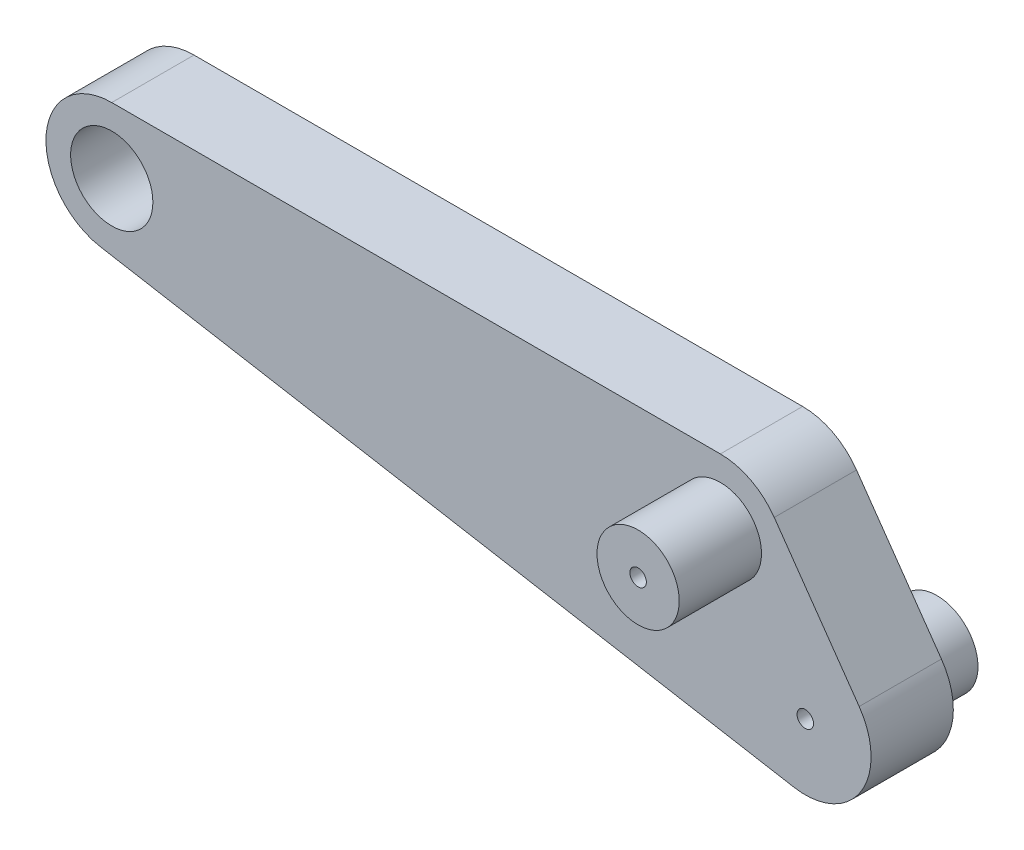
ISO-10303-21;
HEADER;
FILE_DESCRIPTION(('STEP AP214'),'2;1');
FILE_NAME('part.step','',(''),(''),'','','');
FILE_SCHEMA(('AUTOMOTIVE_DESIGN { 1 0 10303 214 1 1 1 1 }'));
ENDSEC;
DATA;
#1=APPLICATION_CONTEXT('core data for automotive mechanical design processes');
#2=APPLICATION_PROTOCOL_DEFINITION('international standard','automotive_design',2000,#1);
#3=PRODUCT_CONTEXT('',#1,'mechanical');
#4=PRODUCT('Part','Part','',(#3));
#5=PRODUCT_RELATED_PRODUCT_CATEGORY('part','',(#4));
#6=PRODUCT_DEFINITION_FORMATION('','',#4);
#7=PRODUCT_DEFINITION_CONTEXT('part definition',#1,'design');
#8=PRODUCT_DEFINITION('design','',#6,#7);
#9=PRODUCT_DEFINITION_SHAPE('','',#8);
#10=(LENGTH_UNIT() NAMED_UNIT(*) SI_UNIT(.MILLI.,.METRE.));
#11=(NAMED_UNIT(*) PLANE_ANGLE_UNIT() SI_UNIT($,.RADIAN.));
#12=(NAMED_UNIT(*) SI_UNIT($,.STERADIAN.) SOLID_ANGLE_UNIT());
#13=UNCERTAINTY_MEASURE_WITH_UNIT(LENGTH_MEASURE(1.E-05),#10,'distance_accuracy_value','');
#14=(GEOMETRIC_REPRESENTATION_CONTEXT(3) GLOBAL_UNCERTAINTY_ASSIGNED_CONTEXT((#13)) GLOBAL_UNIT_ASSIGNED_CONTEXT((#10,
#11,#12)) REPRESENTATION_CONTEXT('',''));
#15=CARTESIAN_POINT('',(0.,0.,0.));
#16=DIRECTION('',(0.,0.,1.));
#17=DIRECTION('',(1.,0.,0.));
#18=AXIS2_PLACEMENT_3D('',#15,#16,#17);
#19=CARTESIAN_POINT('',(0.,0.,5.));
#20=DIRECTION('',(0.,0.,1.));
#21=DIRECTION('',(1.,0.,0.));
#22=AXIS2_PLACEMENT_3D('',#19,#20,#21);
#23=PLANE('',#22);
#24=CARTESIAN_POINT('',(0.,0.,5.));
#25=DIRECTION('',(0.,0.,1.));
#26=DIRECTION('',(1.,0.,0.));
#27=AXIS2_PLACEMENT_3D('',#24,#25,#26);
#28=CIRCLE('',#27,2.5);
#29=CARTESIAN_POINT('',(2.5,0.,5.));
#30=VERTEX_POINT('',#29);
#31=EDGE_CURVE('E215',#30,#30,#28,.T.);
#32=ORIENTED_EDGE('',*,*,#31,.F.);
#33=EDGE_LOOP('',(#32));
#34=FACE_BOUND('',#33,.T.);
#35=CARTESIAN_POINT('',(0.,0.,5.));
#36=DIRECTION('',(0.,0.,1.));
#37=DIRECTION('',(1.,0.,0.));
#38=AXIS2_PLACEMENT_3D('',#35,#36,#37);
#39=CIRCLE('',#38,4.);
#40=CARTESIAN_POINT('',(3.27660817715596,2.2943057454042,5.));
#41=VERTEX_POINT('',#40);
#42=CARTESIAN_POINT('',(0.,4.,5.));
#43=VERTEX_POINT('',#42);
#44=EDGE_CURVE('E130',#41,#43,#39,.T.);
#45=ORIENTED_EDGE('',*,*,#44,.T.);
#46=DIRECTION('',(-1.,0.,0.));
#47=VECTOR('',#46,1.);
#48=CARTESIAN_POINT('',(-37.,3.99999999999999,5.));
#49=LINE('',#48,#47);
#50=CARTESIAN_POINT('',(-37.,3.99999999999999,5.));
#51=VERTEX_POINT('',#50);
#52=EDGE_CURVE('E88',#43,#51,#49,.T.);
#53=ORIENTED_EDGE('',*,*,#52,.T.);
#54=CARTESIAN_POINT('',(-37.,0.,5.));
#55=DIRECTION('',(0.,0.,1.));
#56=DIRECTION('',(1.,0.,0.));
#57=AXIS2_PLACEMENT_3D('',#54,#55,#56);
#58=CIRCLE('',#57,4.);
#59=CARTESIAN_POINT('',(-37.6889759456028,-3.94021727146876,5.));
#60=VERTEX_POINT('',#59);
#61=EDGE_CURVE('E101',#51,#60,#58,.T.);
#62=ORIENTED_EDGE('',*,*,#61,.T.);
#63=DIRECTION('',(0.98505431786719,-0.172243986400701,0.));
#64=VECTOR('',#63,1.);
#65=CARTESIAN_POINT('',(4.47321198155665,-11.3125856700697,5.));
#66=LINE('',#65,#64);
#67=CARTESIAN_POINT('',(4.47321198155665,-11.3125856700697,5.));
#68=VERTEX_POINT('',#67);
#69=EDGE_CURVE('E95',#60,#68,#66,.T.);
#70=ORIENTED_EDGE('',*,*,#69,.T.);
#71=CARTESIAN_POINT('',(5.16218792715945,-7.3723683986009,5.));
#72=DIRECTION('',(0.,0.,1.));
#73=DIRECTION('',(1.,0.,0.));
#74=AXIS2_PLACEMENT_3D('',#71,#72,#73);
#75=CIRCLE('',#74,4.);
#76=CARTESIAN_POINT('',(8.43879610431541,-5.0780626531967,5.));
#77=VERTEX_POINT('',#76);
#78=EDGE_CURVE('E99',#68,#77,#75,.T.);
#79=ORIENTED_EDGE('',*,*,#78,.T.);
#80=DIRECTION('',(-0.57357643635105,0.819152044288989,0.));
#81=VECTOR('',#80,1.);
#82=CARTESIAN_POINT('',(3.27660817715596,2.2943057454042,5.));
#83=LINE('',#82,#81);
#84=EDGE_CURVE('E51',#77,#41,#83,.T.);
#85=ORIENTED_EDGE('',*,*,#84,.T.);
#86=EDGE_LOOP('',(#45,#53,#62,#70,#79,#85));
#87=FACE_BOUND('',#86,.T.);
#88=CARTESIAN_POINT('',(-37.,0.,5.));
#89=DIRECTION('',(0.,0.,1.));
#90=DIRECTION('',(1.,0.,0.));
#91=AXIS2_PLACEMENT_3D('',#88,#89,#90);
#92=CIRCLE('',#91,2.5);
#93=CARTESIAN_POINT('',(-34.5,0.,5.));
#94=VERTEX_POINT('',#93);
#95=EDGE_CURVE('E123',#94,#94,#92,.T.);
#96=ORIENTED_EDGE('',*,*,#95,.F.);
#97=EDGE_LOOP('',(#96));
#98=FACE_BOUND('',#97,.T.);
#99=CARTESIAN_POINT('',(5.16218792715945,-7.3723683986009,5.));
#100=DIRECTION('',(0.,0.,1.));
#101=DIRECTION('',(1.,0.,0.));
#102=AXIS2_PLACEMENT_3D('',#99,#100,#101);
#103=CIRCLE('',#102,0.5);
#104=CARTESIAN_POINT('',(5.66218792715945,-7.3723683986009,5.));
#105=VERTEX_POINT('',#104);
#106=EDGE_CURVE('E203',#105,#105,#103,.T.);
#107=ORIENTED_EDGE('',*,*,#106,.F.);
#108=EDGE_LOOP('',(#107));
#109=FACE_BOUND('',#108,.T.);
#110=ADVANCED_FACE('F34',(#34,#87,#98,#109),#23,.T.);
#111=CARTESIAN_POINT('',(0.,0.,0.));
#112=DIRECTION('',(0.,0.,1.));
#113=DIRECTION('',(1.,0.,0.));
#114=AXIS2_PLACEMENT_3D('',#111,#112,#113);
#115=PLANE('',#114);
#116=CARTESIAN_POINT('',(0.,0.,0.));
#117=DIRECTION('',(0.,0.,1.));
#118=DIRECTION('',(1.,0.,0.));
#119=AXIS2_PLACEMENT_3D('',#116,#117,#118);
#120=CIRCLE('',#119,4.);
#121=CARTESIAN_POINT('',(3.27660817715596,2.2943057454042,0.));
#122=VERTEX_POINT('',#121);
#123=CARTESIAN_POINT('',(0.,4.,0.));
#124=VERTEX_POINT('',#123);
#125=EDGE_CURVE('E119',#122,#124,#120,.T.);
#126=ORIENTED_EDGE('',*,*,#125,.F.);
#127=DIRECTION('',(-0.57357643635105,0.819152044288989,0.));
#128=VECTOR('',#127,1.);
#129=CARTESIAN_POINT('',(3.27660817715596,2.2943057454042,0.));
#130=LINE('',#129,#128);
#131=CARTESIAN_POINT('',(8.43879610431541,-5.0780626531967,0.));
#132=VERTEX_POINT('',#131);
#133=EDGE_CURVE('E80',#132,#122,#130,.T.);
#134=ORIENTED_EDGE('',*,*,#133,.F.);
#135=CARTESIAN_POINT('',(5.16218792715945,-7.3723683986009,0.));
#136=DIRECTION('',(0.,0.,1.));
#137=DIRECTION('',(1.,0.,0.));
#138=AXIS2_PLACEMENT_3D('',#135,#136,#137);
#139=CIRCLE('',#138,4.);
#140=CARTESIAN_POINT('',(4.47321198155665,-11.3125856700697,0.));
#141=VERTEX_POINT('',#140);
#142=EDGE_CURVE('E74',#141,#132,#139,.T.);
#143=ORIENTED_EDGE('',*,*,#142,.F.);
#144=DIRECTION('',(0.98505431786719,-0.172243986400701,0.));
#145=VECTOR('',#144,1.);
#146=CARTESIAN_POINT('',(4.47321198155665,-11.3125856700697,0.));
#147=LINE('',#146,#145);
#148=CARTESIAN_POINT('',(-37.6889759456028,-3.94021727146876,0.));
#149=VERTEX_POINT('',#148);
#150=EDGE_CURVE('E109',#149,#141,#147,.T.);
#151=ORIENTED_EDGE('',*,*,#150,.F.);
#152=CARTESIAN_POINT('',(-37.,0.,0.));
#153=DIRECTION('',(0.,0.,1.));
#154=DIRECTION('',(1.,0.,0.));
#155=AXIS2_PLACEMENT_3D('',#152,#153,#154);
#156=CIRCLE('',#155,4.);
#157=CARTESIAN_POINT('',(-37.,3.99999999999999,0.));
#158=VERTEX_POINT('',#157);
#159=EDGE_CURVE('E125',#158,#149,#156,.T.);
#160=ORIENTED_EDGE('',*,*,#159,.F.);
#161=DIRECTION('',(-1.,0.,0.));
#162=VECTOR('',#161,1.);
#163=CARTESIAN_POINT('',(-37.,3.99999999999999,0.));
#164=LINE('',#163,#162);
#165=EDGE_CURVE('E122',#124,#158,#164,.T.);
#166=ORIENTED_EDGE('',*,*,#165,.F.);
#167=EDGE_LOOP('',(#126,#134,#143,#151,#160,#166));
#168=FACE_BOUND('',#167,.T.);
#169=CARTESIAN_POINT('',(-37.,0.,0.));
#170=DIRECTION('',(0.,0.,1.));
#171=DIRECTION('',(1.,0.,0.));
#172=AXIS2_PLACEMENT_3D('',#169,#170,#171);
#173=CIRCLE('',#172,2.5);
#174=CARTESIAN_POINT('',(-34.5,0.,0.));
#175=VERTEX_POINT('',#174);
#176=EDGE_CURVE('E218',#175,#175,#173,.T.);
#177=ORIENTED_EDGE('',*,*,#176,.T.);
#178=EDGE_LOOP('',(#177));
#179=FACE_BOUND('',#178,.T.);
#180=CARTESIAN_POINT('',(5.16218792715945,-7.3723683986009,0.));
#181=DIRECTION('',(0.,0.,1.));
#182=DIRECTION('',(1.,0.,0.));
#183=AXIS2_PLACEMENT_3D('',#180,#181,#182);
#184=CIRCLE('',#183,2.5);
#185=CARTESIAN_POINT('',(7.66218792715945,-7.3723683986009,0.));
#186=VERTEX_POINT('',#185);
#187=EDGE_CURVE('E212',#186,#186,#184,.T.);
#188=ORIENTED_EDGE('',*,*,#187,.T.);
#189=EDGE_LOOP('',(#188));
#190=FACE_BOUND('',#189,.T.);
#191=CARTESIAN_POINT('',(0.,0.,0.));
#192=DIRECTION('',(0.,0.,-1.));
#193=DIRECTION('',(-1.,0.,0.));
#194=AXIS2_PLACEMENT_3D('',#191,#192,#193);
#195=CIRCLE('',#194,0.5);
#196=CARTESIAN_POINT('',(-0.5,0.,0.));
#197=VERTEX_POINT('',#196);
#198=EDGE_CURVE('E195',#197,#197,#195,.T.);
#199=ORIENTED_EDGE('',*,*,#198,.F.);
#200=EDGE_LOOP('',(#199));
#201=FACE_BOUND('',#200,.T.);
#202=ADVANCED_FACE('F139',(#168,#179,#190,#201),#115,.F.);
#203=CARTESIAN_POINT('',(0.,0.,5.));
#204=DIRECTION('',(0.,0.,-1.));
#205=DIRECTION('',(-1.,0.,0.));
#206=AXIS2_PLACEMENT_3D('',#203,#204,#205);
#207=CYLINDRICAL_SURFACE('',#206,4.);
#208=ORIENTED_EDGE('',*,*,#125,.T.);
#209=DIRECTION('',(0.,0.,-1.));
#210=VECTOR('',#209,1.);
#211=CARTESIAN_POINT('',(0.,4.,5.));
#212=LINE('',#211,#210);
#213=EDGE_CURVE('E11',#43,#124,#212,.T.);
#214=ORIENTED_EDGE('',*,*,#213,.F.);
#215=ORIENTED_EDGE('',*,*,#44,.F.);
#216=DIRECTION('',(0.,0.,-1.));
#217=VECTOR('',#216,1.);
#218=CARTESIAN_POINT('',(3.27660817715596,2.2943057454042,5.));
#219=LINE('',#218,#217);
#220=EDGE_CURVE('E115',#41,#122,#219,.T.);
#221=ORIENTED_EDGE('',*,*,#220,.T.);
#222=EDGE_LOOP('',(#208,#214,#215,#221));
#223=FACE_BOUND('',#222,.T.);
#224=ADVANCED_FACE('F36',(#223),#207,.T.);
#225=CARTESIAN_POINT('',(-37.,3.99999999999999,5.));
#226=DIRECTION('',(0.,-1.,0.));
#227=DIRECTION('',(1.,0.,0.));
#228=AXIS2_PLACEMENT_3D('',#225,#226,#227);
#229=PLANE('',#228);
#230=ORIENTED_EDGE('',*,*,#165,.T.);
#231=DIRECTION('',(0.,0.,-1.));
#232=VECTOR('',#231,1.);
#233=CARTESIAN_POINT('',(-37.,3.99999999999999,5.));
#234=LINE('',#233,#232);
#235=EDGE_CURVE('E43',#51,#158,#234,.T.);
#236=ORIENTED_EDGE('',*,*,#235,.F.);
#237=ORIENTED_EDGE('',*,*,#52,.F.);
#238=ORIENTED_EDGE('',*,*,#213,.T.);
#239=EDGE_LOOP('',(#230,#236,#237,#238));
#240=FACE_BOUND('',#239,.T.);
#241=ADVANCED_FACE('F303',(#240),#229,.F.);
#242=CARTESIAN_POINT('',(-37.,0.,5.));
#243=DIRECTION('',(0.,0.,-1.));
#244=DIRECTION('',(-1.,0.,0.));
#245=AXIS2_PLACEMENT_3D('',#242,#243,#244);
#246=CYLINDRICAL_SURFACE('',#245,4.);
#247=ORIENTED_EDGE('',*,*,#159,.T.);
#248=DIRECTION('',(0.,0.,-1.));
#249=VECTOR('',#248,1.);
#250=CARTESIAN_POINT('',(-37.6889759456028,-3.94021727146876,5.));
#251=LINE('',#250,#249);
#252=EDGE_CURVE('E110',#60,#149,#251,.T.);
#253=ORIENTED_EDGE('',*,*,#252,.F.);
#254=ORIENTED_EDGE('',*,*,#61,.F.);
#255=ORIENTED_EDGE('',*,*,#235,.T.);
#256=EDGE_LOOP('',(#247,#253,#254,#255));
#257=FACE_BOUND('',#256,.T.);
#258=ADVANCED_FACE('F136',(#257),#246,.T.);
#259=CARTESIAN_POINT('',(4.47321198155665,-11.3125856700697,5.));
#260=DIRECTION('',(0.172243986400701,0.98505431786719,0.));
#261=DIRECTION('',(-0.98505431786719,0.172243986400701,0.));
#262=AXIS2_PLACEMENT_3D('',#259,#260,#261);
#263=PLANE('',#262);
#264=ORIENTED_EDGE('',*,*,#150,.T.);
#265=DIRECTION('',(0.,0.,-1.));
#266=VECTOR('',#265,1.);
#267=CARTESIAN_POINT('',(4.47321198155665,-11.3125856700697,5.));
#268=LINE('',#267,#266);
#269=EDGE_CURVE('E106',#68,#141,#268,.T.);
#270=ORIENTED_EDGE('',*,*,#269,.F.);
#271=ORIENTED_EDGE('',*,*,#69,.F.);
#272=ORIENTED_EDGE('',*,*,#252,.T.);
#273=EDGE_LOOP('',(#264,#270,#271,#272));
#274=FACE_BOUND('',#273,.T.);
#275=ADVANCED_FACE('F107',(#274),#263,.F.);
#276=CARTESIAN_POINT('',(5.16218792715945,-7.3723683986009,5.));
#277=DIRECTION('',(0.,0.,-1.));
#278=DIRECTION('',(-1.,0.,0.));
#279=AXIS2_PLACEMENT_3D('',#276,#277,#278);
#280=CYLINDRICAL_SURFACE('',#279,4.);
#281=ORIENTED_EDGE('',*,*,#142,.T.);
#282=DIRECTION('',(0.,0.,-1.));
#283=VECTOR('',#282,1.);
#284=CARTESIAN_POINT('',(8.43879610431541,-5.0780626531967,5.));
#285=LINE('',#284,#283);
#286=EDGE_CURVE('E111',#77,#132,#285,.T.);
#287=ORIENTED_EDGE('',*,*,#286,.F.);
#288=ORIENTED_EDGE('',*,*,#78,.F.);
#289=ORIENTED_EDGE('',*,*,#269,.T.);
#290=EDGE_LOOP('',(#281,#287,#288,#289));
#291=FACE_BOUND('',#290,.T.);
#292=ADVANCED_FACE('F113',(#291),#280,.T.);
#293=CARTESIAN_POINT('',(3.27660817715596,2.2943057454042,5.));
#294=DIRECTION('',(-0.819152044288989,-0.57357643635105,0.));
#295=DIRECTION('',(0.57357643635105,-0.819152044288989,0.));
#296=AXIS2_PLACEMENT_3D('',#293,#294,#295);
#297=PLANE('',#296);
#298=ORIENTED_EDGE('',*,*,#133,.T.);
#299=ORIENTED_EDGE('',*,*,#220,.F.);
#300=ORIENTED_EDGE('',*,*,#84,.F.);
#301=ORIENTED_EDGE('',*,*,#286,.T.);
#302=EDGE_LOOP('',(#298,#299,#300,#301));
#303=FACE_BOUND('',#302,.T.);
#304=ADVANCED_FACE('F144',(#303),#297,.F.);
#305=CARTESIAN_POINT('',(-37.,0.,5.));
#306=DIRECTION('',(0.,0.,-1.));
#307=DIRECTION('',(-1.,0.,0.));
#308=AXIS2_PLACEMENT_3D('',#305,#306,#307);
#309=CYLINDRICAL_SURFACE('',#308,2.5);
#310=ORIENTED_EDGE('',*,*,#95,.T.);
#311=EDGE_LOOP('',(#310));
#312=FACE_BOUND('',#311,.T.);
#313=ORIENTED_EDGE('',*,*,#176,.F.);
#314=EDGE_LOOP('',(#313));
#315=FACE_BOUND('',#314,.T.);
#316=ADVANCED_FACE('F146',(#312,#315),#309,.F.);
#317=CARTESIAN_POINT('',(5.16218792715945,-7.3723683986009,-3.));
#318=DIRECTION('',(0.,0.,1.));
#319=DIRECTION('',(1.,0.,0.));
#320=AXIS2_PLACEMENT_3D('',#317,#318,#319);
#321=CYLINDRICAL_SURFACE('',#320,2.5);
#322=CARTESIAN_POINT('',(5.16218792715945,-7.3723683986009,-3.));
#323=DIRECTION('',(0.,0.,1.));
#324=DIRECTION('',(1.,0.,0.));
#325=AXIS2_PLACEMENT_3D('',#322,#323,#324);
#326=CIRCLE('',#325,2.5);
#327=CARTESIAN_POINT('',(7.66218792715945,-7.3723683986009,-3.));
#328=VERTEX_POINT('',#327);
#329=EDGE_CURVE('E207',#328,#328,#326,.T.);
#330=ORIENTED_EDGE('',*,*,#329,.T.);
#331=EDGE_LOOP('',(#330));
#332=FACE_BOUND('',#331,.T.);
#333=ORIENTED_EDGE('',*,*,#187,.F.);
#334=EDGE_LOOP('',(#333));
#335=FACE_BOUND('',#334,.T.);
#336=ADVANCED_FACE('F152',(#332,#335),#321,.T.);
#337=CARTESIAN_POINT('',(5.16218792715945,-7.3723683986009,-3.));
#338=DIRECTION('',(0.,0.,1.));
#339=DIRECTION('',(1.,0.,0.));
#340=AXIS2_PLACEMENT_3D('',#337,#338,#339);
#341=PLANE('',#340);
#342=CARTESIAN_POINT('',(5.16218792715945,-7.3723683986009,-3.));
#343=DIRECTION('',(0.,0.,1.));
#344=DIRECTION('',(1.,0.,0.));
#345=AXIS2_PLACEMENT_3D('',#342,#343,#344);
#346=CIRCLE('',#345,0.5);
#347=CARTESIAN_POINT('',(5.66218792715945,-7.3723683986009,-3.));
#348=VERTEX_POINT('',#347);
#349=EDGE_CURVE('E204',#348,#348,#346,.T.);
#350=ORIENTED_EDGE('',*,*,#349,.T.);
#351=EDGE_LOOP('',(#350));
#352=FACE_BOUND('',#351,.T.);
#353=ORIENTED_EDGE('',*,*,#329,.F.);
#354=EDGE_LOOP('',(#353));
#355=FACE_BOUND('',#354,.T.);
#356=ADVANCED_FACE('F167',(#352,#355),#341,.F.);
#357=CARTESIAN_POINT('',(5.16218792715945,-7.3723683986009,-3.));
#358=DIRECTION('',(0.,0.,1.));
#359=DIRECTION('',(1.,0.,0.));
#360=AXIS2_PLACEMENT_3D('',#357,#358,#359);
#361=CYLINDRICAL_SURFACE('',#360,0.5);
#362=ORIENTED_EDGE('',*,*,#349,.F.);
#363=EDGE_LOOP('',(#362));
#364=FACE_BOUND('',#363,.T.);
#365=ORIENTED_EDGE('',*,*,#106,.T.);
#366=EDGE_LOOP('',(#365));
#367=FACE_BOUND('',#366,.T.);
#368=ADVANCED_FACE('F171',(#364,#367),#361,.F.);
#369=CARTESIAN_POINT('',(0.,0.,10.));
#370=DIRECTION('',(0.,0.,-1.));
#371=DIRECTION('',(-1.,0.,0.));
#372=AXIS2_PLACEMENT_3D('',#369,#370,#371);
#373=CYLINDRICAL_SURFACE('',#372,2.5);
#374=ORIENTED_EDGE('',*,*,#31,.T.);
#375=EDGE_LOOP('',(#374));
#376=FACE_BOUND('',#375,.T.);
#377=CARTESIAN_POINT('',(0.,0.,10.));
#378=DIRECTION('',(0.,0.,-1.));
#379=DIRECTION('',(-1.,0.,0.));
#380=AXIS2_PLACEMENT_3D('',#377,#378,#379);
#381=CIRCLE('',#380,2.5);
#382=CARTESIAN_POINT('',(-2.5,0.,10.));
#383=VERTEX_POINT('',#382);
#384=EDGE_CURVE('E198',#383,#383,#381,.T.);
#385=ORIENTED_EDGE('',*,*,#384,.T.);
#386=EDGE_LOOP('',(#385));
#387=FACE_BOUND('',#386,.T.);
#388=ADVANCED_FACE('F175',(#376,#387),#373,.T.);
#389=CARTESIAN_POINT('',(0.,0.,10.));
#390=DIRECTION('',(0.,0.,-1.));
#391=DIRECTION('',(-1.,0.,0.));
#392=AXIS2_PLACEMENT_3D('',#389,#390,#391);
#393=PLANE('',#392);
#394=CARTESIAN_POINT('',(0.,0.,10.));
#395=DIRECTION('',(0.,0.,-1.));
#396=DIRECTION('',(-1.,0.,0.));
#397=AXIS2_PLACEMENT_3D('',#394,#395,#396);
#398=CIRCLE('',#397,0.5);
#399=CARTESIAN_POINT('',(-0.5,0.,10.));
#400=VERTEX_POINT('',#399);
#401=EDGE_CURVE('E192',#400,#400,#398,.T.);
#402=ORIENTED_EDGE('',*,*,#401,.T.);
#403=EDGE_LOOP('',(#402));
#404=FACE_BOUND('',#403,.T.);
#405=ORIENTED_EDGE('',*,*,#384,.F.);
#406=EDGE_LOOP('',(#405));
#407=FACE_BOUND('',#406,.T.);
#408=ADVANCED_FACE('F179',(#404,#407),#393,.F.);
#409=CARTESIAN_POINT('',(0.,0.,10.));
#410=DIRECTION('',(0.,0.,-1.));
#411=DIRECTION('',(-1.,0.,0.));
#412=AXIS2_PLACEMENT_3D('',#409,#410,#411);
#413=CYLINDRICAL_SURFACE('',#412,0.5);
#414=ORIENTED_EDGE('',*,*,#401,.F.);
#415=EDGE_LOOP('',(#414));
#416=FACE_BOUND('',#415,.T.);
#417=ORIENTED_EDGE('',*,*,#198,.T.);
#418=EDGE_LOOP('',(#417));
#419=FACE_BOUND('',#418,.T.);
#420=ADVANCED_FACE('F183',(#416,#419),#413,.F.);
#421=CLOSED_SHELL('',(#110,#202,#224,#241,#258,#275,#292,#304,#316,#336,#356,#368,#388,#408,#420));
#422=MANIFOLD_SOLID_BREP('B2',#421);
#423=ADVANCED_BREP_SHAPE_REPRESENTATION('',(#18,#422),#14);
#424=SHAPE_DEFINITION_REPRESENTATION(#9,#423);
ENDSEC;
END-ISO-10303-21;
